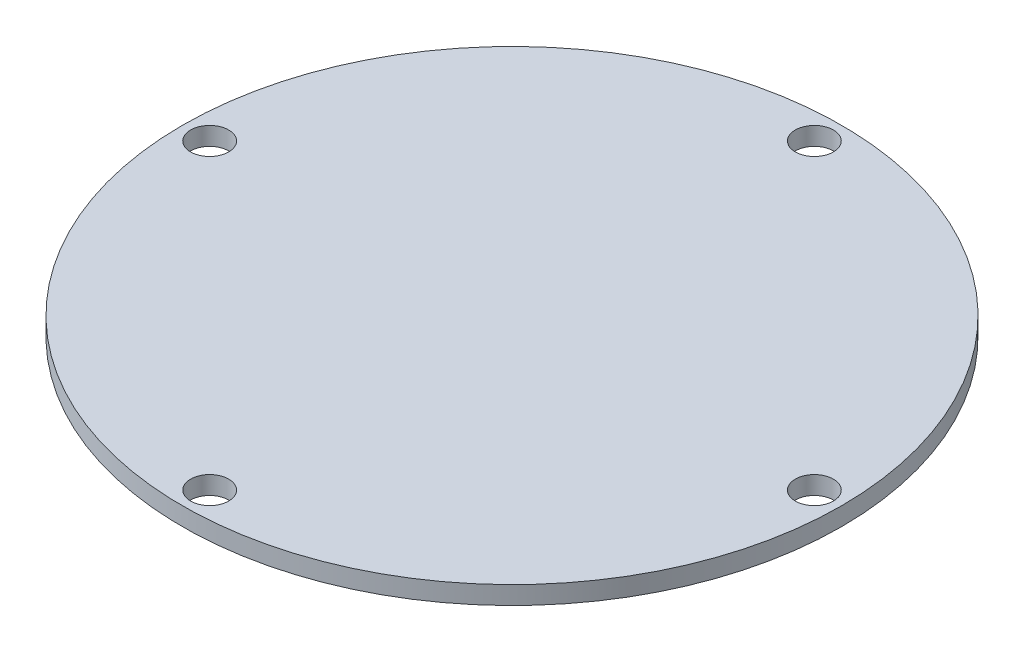
ISO-10303-21;
HEADER;
FILE_DESCRIPTION(('STEP AP214'),'2;1');
FILE_NAME('part.step','',(''),(''),'','','');
FILE_SCHEMA(('AUTOMOTIVE_DESIGN { 1 0 10303 214 1 1 1 1 }'));
ENDSEC;
DATA;
#1=APPLICATION_CONTEXT('core data for automotive mechanical design processes');
#2=APPLICATION_PROTOCOL_DEFINITION('international standard','automotive_design',2000,#1);
#3=PRODUCT_CONTEXT('',#1,'mechanical');
#4=PRODUCT('Part','Part','',(#3));
#5=PRODUCT_RELATED_PRODUCT_CATEGORY('part','',(#4));
#6=PRODUCT_DEFINITION_FORMATION('','',#4);
#7=PRODUCT_DEFINITION_CONTEXT('part definition',#1,'design');
#8=PRODUCT_DEFINITION('design','',#6,#7);
#9=PRODUCT_DEFINITION_SHAPE('','',#8);
#10=(LENGTH_UNIT() NAMED_UNIT(*) SI_UNIT(.MILLI.,.METRE.));
#11=(NAMED_UNIT(*) PLANE_ANGLE_UNIT() SI_UNIT($,.RADIAN.));
#12=(NAMED_UNIT(*) SI_UNIT($,.STERADIAN.) SOLID_ANGLE_UNIT());
#13=UNCERTAINTY_MEASURE_WITH_UNIT(LENGTH_MEASURE(1.E-05),#10,'distance_accuracy_value','');
#14=(GEOMETRIC_REPRESENTATION_CONTEXT(3) GLOBAL_UNCERTAINTY_ASSIGNED_CONTEXT((#13)) GLOBAL_UNIT_ASSIGNED_CONTEXT((#10,
#11,#12)) REPRESENTATION_CONTEXT('',''));
#15=CARTESIAN_POINT('',(0.,0.,0.));
#16=DIRECTION('',(0.,0.,1.));
#17=DIRECTION('',(1.,0.,0.));
#18=AXIS2_PLACEMENT_3D('',#15,#16,#17);
#19=CARTESIAN_POINT('',(0.,3.,-50.));
#20=DIRECTION('',(0.,-1.,0.));
#21=DIRECTION('',(1.,0.,0.));
#22=AXIS2_PLACEMENT_3D('',#19,#20,#21);
#23=CYLINDRICAL_SURFACE('',#22,3.15);
#24=CARTESIAN_POINT('',(0.,3.,-50.));
#25=DIRECTION('',(0.,-1.,0.));
#26=DIRECTION('',(1.,0.,0.));
#27=AXIS2_PLACEMENT_3D('',#24,#25,#26);
#28=CIRCLE('',#27,3.15);
#29=CARTESIAN_POINT('',(-3.15,3.,-50.));
#30=VERTEX_POINT('',#29);
#31=EDGE_CURVE('E107',#30,#30,#28,.T.);
#32=ORIENTED_EDGE('',*,*,#31,.F.);
#33=DIRECTION('',(0.,-1.,0.));
#34=VECTOR('',#33,1.);
#35=CARTESIAN_POINT('',(-3.15,3.,-50.));
#36=LINE('',#35,#34);
#37=CARTESIAN_POINT('',(-3.15,0.,-50.));
#38=VERTEX_POINT('',#37);
#39=EDGE_CURVE('E11',#30,#38,#36,.T.);
#40=ORIENTED_EDGE('',*,*,#39,.T.);
#41=CARTESIAN_POINT('',(0.,0.,-50.));
#42=DIRECTION('',(0.,-1.,0.));
#43=DIRECTION('',(1.,0.,0.));
#44=AXIS2_PLACEMENT_3D('',#41,#42,#43);
#45=CIRCLE('',#44,3.15);
#46=EDGE_CURVE('E99',#38,#38,#45,.T.);
#47=ORIENTED_EDGE('',*,*,#46,.T.);
#48=ORIENTED_EDGE('',*,*,#39,.F.);
#49=EDGE_LOOP('',(#32,#40,#47,#48));
#50=FACE_BOUND('',#49,.T.);
#51=ADVANCED_FACE('F17',(#50),#23,.F.);
#52=CARTESIAN_POINT('',(-50.,3.,0.));
#53=DIRECTION('',(0.,-1.,0.));
#54=DIRECTION('',(1.,0.,0.));
#55=AXIS2_PLACEMENT_3D('',#52,#53,#54);
#56=CYLINDRICAL_SURFACE('',#55,3.15);
#57=CARTESIAN_POINT('',(-50.,3.,0.));
#58=DIRECTION('',(0.,-1.,0.));
#59=DIRECTION('',(1.,0.,0.));
#60=AXIS2_PLACEMENT_3D('',#57,#58,#59);
#61=CIRCLE('',#60,3.15);
#62=CARTESIAN_POINT('',(-53.15,3.,0.));
#63=VERTEX_POINT('',#62);
#64=EDGE_CURVE('E21',#63,#63,#61,.T.);
#65=ORIENTED_EDGE('',*,*,#64,.F.);
#66=DIRECTION('',(0.,-1.,0.));
#67=VECTOR('',#66,1.);
#68=CARTESIAN_POINT('',(-53.15,3.,0.));
#69=LINE('',#68,#67);
#70=CARTESIAN_POINT('',(-53.15,0.,0.));
#71=VERTEX_POINT('',#70);
#72=EDGE_CURVE('E28',#63,#71,#69,.T.);
#73=ORIENTED_EDGE('',*,*,#72,.T.);
#74=CARTESIAN_POINT('',(-50.,0.,0.));
#75=DIRECTION('',(0.,-1.,0.));
#76=DIRECTION('',(1.,0.,0.));
#77=AXIS2_PLACEMENT_3D('',#74,#75,#76);
#78=CIRCLE('',#77,3.15);
#79=EDGE_CURVE('E121',#71,#71,#78,.T.);
#80=ORIENTED_EDGE('',*,*,#79,.T.);
#81=ORIENTED_EDGE('',*,*,#72,.F.);
#82=EDGE_LOOP('',(#65,#73,#80,#81));
#83=FACE_BOUND('',#82,.T.);
#84=ADVANCED_FACE('F133',(#83),#56,.F.);
#85=CARTESIAN_POINT('',(0.,3.,50.));
#86=DIRECTION('',(0.,-1.,0.));
#87=DIRECTION('',(1.,0.,0.));
#88=AXIS2_PLACEMENT_3D('',#85,#86,#87);
#89=CYLINDRICAL_SURFACE('',#88,3.15);
#90=CARTESIAN_POINT('',(0.,3.,50.));
#91=DIRECTION('',(0.,-1.,0.));
#92=DIRECTION('',(1.,0.,0.));
#93=AXIS2_PLACEMENT_3D('',#90,#91,#92);
#94=CIRCLE('',#93,3.15);
#95=CARTESIAN_POINT('',(-3.15,3.,50.));
#96=VERTEX_POINT('',#95);
#97=EDGE_CURVE('E97',#96,#96,#94,.T.);
#98=ORIENTED_EDGE('',*,*,#97,.F.);
#99=DIRECTION('',(0.,-1.,0.));
#100=VECTOR('',#99,1.);
#101=CARTESIAN_POINT('',(-3.15,3.,50.));
#102=LINE('',#101,#100);
#103=CARTESIAN_POINT('',(-3.15,0.,50.));
#104=VERTEX_POINT('',#103);
#105=EDGE_CURVE('E106',#96,#104,#102,.T.);
#106=ORIENTED_EDGE('',*,*,#105,.T.);
#107=CARTESIAN_POINT('',(0.,0.,50.));
#108=DIRECTION('',(0.,-1.,0.));
#109=DIRECTION('',(1.,0.,0.));
#110=AXIS2_PLACEMENT_3D('',#107,#108,#109);
#111=CIRCLE('',#110,3.15);
#112=EDGE_CURVE('E117',#104,#104,#111,.T.);
#113=ORIENTED_EDGE('',*,*,#112,.T.);
#114=ORIENTED_EDGE('',*,*,#105,.F.);
#115=EDGE_LOOP('',(#98,#106,#113,#114));
#116=FACE_BOUND('',#115,.T.);
#117=ADVANCED_FACE('F19',(#116),#89,.F.);
#118=CARTESIAN_POINT('',(50.,3.,0.));
#119=DIRECTION('',(0.,-1.,0.));
#120=DIRECTION('',(1.,0.,0.));
#121=AXIS2_PLACEMENT_3D('',#118,#119,#120);
#122=CYLINDRICAL_SURFACE('',#121,3.15);
#123=CARTESIAN_POINT('',(50.,3.,0.));
#124=DIRECTION('',(0.,-1.,0.));
#125=DIRECTION('',(1.,0.,0.));
#126=AXIS2_PLACEMENT_3D('',#123,#124,#125);
#127=CIRCLE('',#126,3.15);
#128=CARTESIAN_POINT('',(46.85,3.,0.));
#129=VERTEX_POINT('',#128);
#130=EDGE_CURVE('E90',#129,#129,#127,.T.);
#131=ORIENTED_EDGE('',*,*,#130,.F.);
#132=DIRECTION('',(0.,-1.,0.));
#133=VECTOR('',#132,1.);
#134=CARTESIAN_POINT('',(46.85,3.,0.));
#135=LINE('',#134,#133);
#136=CARTESIAN_POINT('',(46.85,0.,0.));
#137=VERTEX_POINT('',#136);
#138=EDGE_CURVE('E67',#129,#137,#135,.T.);
#139=ORIENTED_EDGE('',*,*,#138,.T.);
#140=CARTESIAN_POINT('',(50.,0.,0.));
#141=DIRECTION('',(0.,-1.,0.));
#142=DIRECTION('',(1.,0.,0.));
#143=AXIS2_PLACEMENT_3D('',#140,#141,#142);
#144=CIRCLE('',#143,3.15);
#145=EDGE_CURVE('E114',#137,#137,#144,.T.);
#146=ORIENTED_EDGE('',*,*,#145,.T.);
#147=ORIENTED_EDGE('',*,*,#138,.F.);
#148=EDGE_LOOP('',(#131,#139,#146,#147));
#149=FACE_BOUND('',#148,.T.);
#150=ADVANCED_FACE('F165',(#149),#122,.F.);
#151=CARTESIAN_POINT('',(0.,3.,0.));
#152=DIRECTION('',(0.,-1.,0.));
#153=DIRECTION('',(0.,0.,-1.));
#154=AXIS2_PLACEMENT_3D('',#151,#152,#153);
#155=PLANE('',#154);
#156=ORIENTED_EDGE('',*,*,#31,.T.);
#157=EDGE_LOOP('',(#156));
#158=FACE_BOUND('',#157,.T.);
#159=ORIENTED_EDGE('',*,*,#64,.T.);
#160=EDGE_LOOP('',(#159));
#161=FACE_BOUND('',#160,.T.);
#162=ORIENTED_EDGE('',*,*,#97,.T.);
#163=EDGE_LOOP('',(#162));
#164=FACE_BOUND('',#163,.T.);
#165=ORIENTED_EDGE('',*,*,#130,.T.);
#166=EDGE_LOOP('',(#165));
#167=FACE_BOUND('',#166,.T.);
#168=CARTESIAN_POINT('',(0.,3.,0.));
#169=DIRECTION('',(0.,-1.,0.));
#170=DIRECTION('',(1.,0.,0.));
#171=AXIS2_PLACEMENT_3D('',#168,#169,#170);
#172=CIRCLE('',#171,54.5);
#173=CARTESIAN_POINT('',(54.5,3.,0.));
#174=VERTEX_POINT('',#173);
#175=EDGE_CURVE('E86',#174,#174,#172,.T.);
#176=ORIENTED_EDGE('',*,*,#175,.F.);
#177=EDGE_LOOP('',(#176));
#178=FACE_BOUND('',#177,.T.);
#179=ADVANCED_FACE('F137',(#158,#161,#164,#167,#178),#155,.F.);
#180=CARTESIAN_POINT('',(0.,3.15,0.));
#181=DIRECTION('',(0.,-1.,0.));
#182=DIRECTION('',(-1.,0.,0.));
#183=AXIS2_PLACEMENT_3D('',#180,#181,#182);
#184=CYLINDRICAL_SURFACE('',#183,54.5);
#185=CARTESIAN_POINT('',(0.,0.,0.));
#186=DIRECTION('',(0.,-1.,0.));
#187=DIRECTION('',(1.,0.,0.));
#188=AXIS2_PLACEMENT_3D('',#185,#186,#187);
#189=CIRCLE('',#188,54.5);
#190=CARTESIAN_POINT('',(54.5,0.,0.));
#191=VERTEX_POINT('',#190);
#192=EDGE_CURVE('E111',#191,#191,#189,.T.);
#193=ORIENTED_EDGE('',*,*,#192,.F.);
#194=DIRECTION('',(0.,1.,0.));
#195=VECTOR('',#194,1.);
#196=CARTESIAN_POINT('',(54.5,3.15,0.));
#197=LINE('',#196,#195);
#198=EDGE_CURVE('E55',#191,#174,#197,.T.);
#199=ORIENTED_EDGE('',*,*,#198,.T.);
#200=ORIENTED_EDGE('',*,*,#175,.T.);
#201=ORIENTED_EDGE('',*,*,#198,.F.);
#202=EDGE_LOOP('',(#193,#199,#200,#201));
#203=FACE_BOUND('',#202,.T.);
#204=ADVANCED_FACE('F87',(#203),#184,.T.);
#205=CARTESIAN_POINT('',(0.,0.,0.));
#206=DIRECTION('',(0.,-1.,0.));
#207=DIRECTION('',(0.,0.,-1.));
#208=AXIS2_PLACEMENT_3D('',#205,#206,#207);
#209=PLANE('',#208);
#210=ORIENTED_EDGE('',*,*,#46,.F.);
#211=EDGE_LOOP('',(#210));
#212=FACE_BOUND('',#211,.T.);
#213=ORIENTED_EDGE('',*,*,#79,.F.);
#214=EDGE_LOOP('',(#213));
#215=FACE_BOUND('',#214,.T.);
#216=ORIENTED_EDGE('',*,*,#112,.F.);
#217=EDGE_LOOP('',(#216));
#218=FACE_BOUND('',#217,.T.);
#219=ORIENTED_EDGE('',*,*,#145,.F.);
#220=EDGE_LOOP('',(#219));
#221=FACE_BOUND('',#220,.T.);
#222=ORIENTED_EDGE('',*,*,#192,.T.);
#223=EDGE_LOOP('',(#222));
#224=FACE_BOUND('',#223,.T.);
#225=ADVANCED_FACE('F156',(#212,#215,#218,#221,#224),#209,.T.);
#226=CLOSED_SHELL('',(#51,#84,#117,#150,#179,#204,#225));
#227=MANIFOLD_SOLID_BREP('B1',#226);
#228=ADVANCED_BREP_SHAPE_REPRESENTATION('',(#18,#227),#14);
#229=SHAPE_DEFINITION_REPRESENTATION(#9,#228);
ENDSEC;
END-ISO-10303-21;
